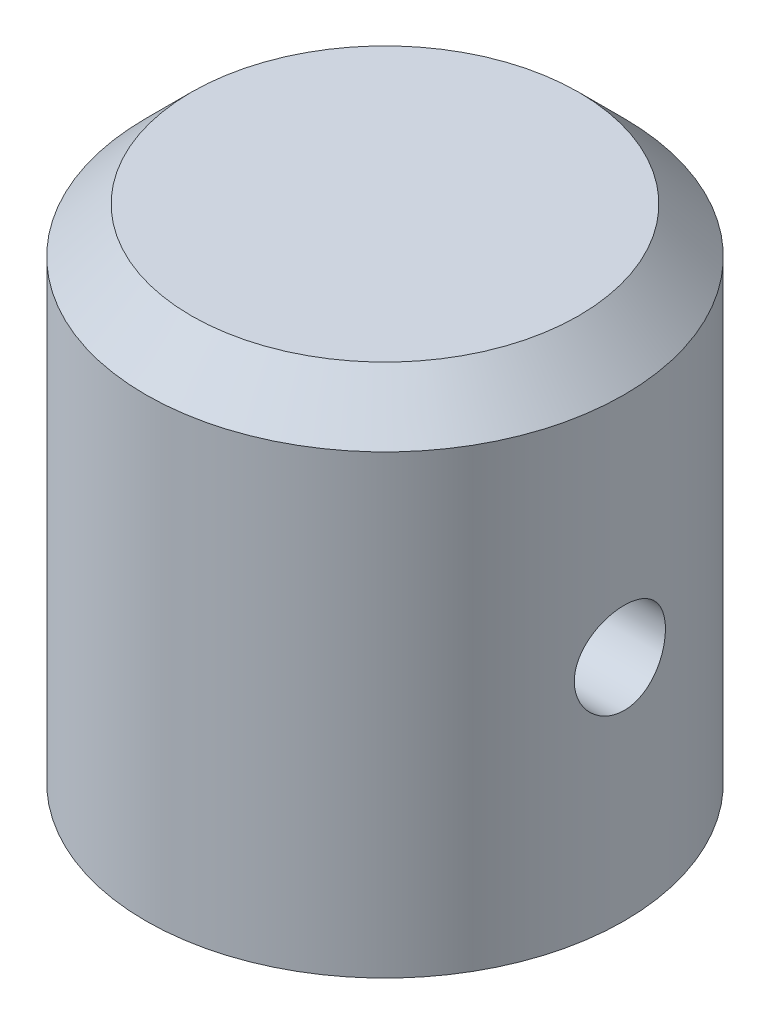
ISO-10303-21;
HEADER;
FILE_DESCRIPTION(('STEP AP214'),'2;1');
FILE_NAME('part.step','',(''),(''),'','','');
FILE_SCHEMA(('AUTOMOTIVE_DESIGN { 1 0 10303 214 1 1 1 1 }'));
ENDSEC;
DATA;
#1=APPLICATION_CONTEXT('core data for automotive mechanical design processes');
#2=APPLICATION_PROTOCOL_DEFINITION('international standard','automotive_design',2000,#1);
#3=PRODUCT_CONTEXT('',#1,'mechanical');
#4=PRODUCT('Part','Part','',(#3));
#5=PRODUCT_RELATED_PRODUCT_CATEGORY('part','',(#4));
#6=PRODUCT_DEFINITION_FORMATION('','',#4);
#7=PRODUCT_DEFINITION_CONTEXT('part definition',#1,'design');
#8=PRODUCT_DEFINITION('design','',#6,#7);
#9=PRODUCT_DEFINITION_SHAPE('','',#8);
#10=(LENGTH_UNIT() NAMED_UNIT(*) SI_UNIT(.MILLI.,.METRE.));
#11=(NAMED_UNIT(*) PLANE_ANGLE_UNIT() SI_UNIT($,.RADIAN.));
#12=(NAMED_UNIT(*) SI_UNIT($,.STERADIAN.) SOLID_ANGLE_UNIT());
#13=UNCERTAINTY_MEASURE_WITH_UNIT(LENGTH_MEASURE(1.E-05),#10,'distance_accuracy_value','');
#14=(GEOMETRIC_REPRESENTATION_CONTEXT(3) GLOBAL_UNCERTAINTY_ASSIGNED_CONTEXT((#13)) GLOBAL_UNIT_ASSIGNED_CONTEXT((#10,
#11,#12)) REPRESENTATION_CONTEXT('',''));
#15=CARTESIAN_POINT('',(0.,0.,0.));
#16=DIRECTION('',(0.,0.,1.));
#17=DIRECTION('',(1.,0.,0.));
#18=AXIS2_PLACEMENT_3D('',#15,#16,#17);
#19=CARTESIAN_POINT('',(-10.5,10.,0.));
#20=DIRECTION('',(1.,0.,0.));
#21=DIRECTION('',(0.,0.,-1.));
#22=AXIS2_PLACEMENT_3D('',#19,#20,#21);
#23=CYLINDRICAL_SURFACE('',#22,2.);
#24=CARTESIAN_POINT('',(5.,10.,0.));
#25=DIRECTION('',(-1.,0.,0.));
#26=DIRECTION('',(0.,0.,1.));
#27=AXIS2_PLACEMENT_3D('',#24,#25,#26);
#28=CIRCLE('',#27,2.);
#29=CARTESIAN_POINT('',(5.,10.,2.));
#30=VERTEX_POINT('',#29);
#31=EDGE_CURVE('E184',#30,#30,#28,.T.);
#32=ORIENTED_EDGE('',*,*,#31,.T.);
#33=EDGE_LOOP('',(#32));
#34=FACE_BOUND('',#33,.T.);
#35=CARTESIAN_POINT('',(10.3077640640442,10.,-2.));
#36=CARTESIAN_POINT('',(10.3077662331161,9.88875796571473,-1.99999576747856));
#37=CARTESIAN_POINT('',(10.3095844213753,9.77746139759584,-1.99068741084945));
#38=CARTESIAN_POINT('',(10.3166512903101,9.55800893114557,-1.95372640408913));
#39=CARTESIAN_POINT('',(10.3219028425853,9.44985574103166,-1.92605839800912));
#40=CARTESIAN_POINT('',(10.3352205759115,9.23989698271584,-1.85326060026377));
#41=CARTESIAN_POINT('',(10.3432840931504,9.13808551412126,-1.80814733034197));
#42=CARTESIAN_POINT('',(10.3613140447469,8.94348177979402,-1.70178371624362));
#43=CARTESIAN_POINT('',(10.3712803404791,8.85068885776445,-1.64053454751282));
#44=CARTESIAN_POINT('',(10.3921358315924,8.67555844408467,-1.50279954107446));
#45=CARTESIAN_POINT('',(10.4030343280567,8.59335356666773,-1.42614646664807));
#46=CARTESIAN_POINT('',(10.4244441525531,8.44288870773657,-1.2601409610314));
#47=CARTESIAN_POINT('',(10.4349554547355,8.37462965588197,-1.17078768389031));
#48=CARTESIAN_POINT('',(10.4545063484475,8.25348439750393,-0.981045466793122));
#49=CARTESIAN_POINT('',(10.4635337012442,8.20072345659818,-0.880575179073301));
#50=CARTESIAN_POINT('',(10.4789953609074,8.11287945215396,-0.671995748816202));
#51=CARTESIAN_POINT('',(10.4854298877952,8.07779488857456,-0.563887255355323));
#52=CARTESIAN_POINT('',(10.4949152003273,8.02671027905441,-0.344474928085005));
#53=CARTESIAN_POINT('',(10.4980056086445,8.01048658544844,-0.233224906241221));
#54=CARTESIAN_POINT('',(10.5005911121681,7.99688718076387,-0.00954197299762809));
#55=CARTESIAN_POINT('',(10.5000865229021,7.99950981557087,0.102890833726007));
#56=CARTESIAN_POINT('',(10.4955697879858,8.02335753885228,0.324213319087035));
#57=CARTESIAN_POINT('',(10.4916030541438,8.04434179306834,0.433130008737613));
#58=CARTESIAN_POINT('',(10.4806587329107,8.10393593464111,0.645867459868355));
#59=CARTESIAN_POINT('',(10.4736810332228,8.14254647938914,0.749688031123387));
#60=CARTESIAN_POINT('',(10.4574231445239,8.2365251783876,0.949982043237765));
#61=CARTESIAN_POINT('',(10.4481298452825,8.29198915833133,1.04640941469805));
#62=CARTESIAN_POINT('',(10.4282677453701,8.41802963236505,1.22867819746181));
#63=CARTESIAN_POINT('',(10.4176988110517,8.48860771054964,1.31451849765684));
#64=CARTESIAN_POINT('',(10.3962580003512,8.64419868339652,1.47460391847545));
#65=CARTESIAN_POINT('',(10.385383976594,8.72942229466572,1.54864409461801));
#66=CARTESIAN_POINT('',(10.3647181130096,8.91118441020868,1.68141214001886));
#67=CARTESIAN_POINT('',(10.3549262900386,9.00772309067514,1.74013977079181));
#68=CARTESIAN_POINT('',(10.3375301079842,9.2096519451659,1.84067693368896));
#69=CARTESIAN_POINT('',(10.3299297088641,9.31505770390328,1.88245589383698));
#70=CARTESIAN_POINT('',(10.3178369316443,9.53157019002549,1.94765282338577));
#71=CARTESIAN_POINT('',(10.3133441891954,9.64267624745234,1.97107294526376));
#72=CARTESIAN_POINT('',(10.3080477071057,9.86558516725025,1.9985865151718));
#73=CARTESIAN_POINT('',(10.3071877035286,9.97735034460876,2.0029747581422));
#74=CARTESIAN_POINT('',(10.3091034020993,10.2000162650894,1.99309094275412));
#75=CARTESIAN_POINT('',(10.3118789183607,10.3109170521167,1.97881983846034));
#76=CARTESIAN_POINT('',(10.3207004508845,10.5277319228755,1.9322757581448));
#77=CARTESIAN_POINT('',(10.3267182518009,10.6336805820355,1.9001580145427));
#78=CARTESIAN_POINT('',(10.3413218894342,10.8386927626591,1.81899736459844));
#79=CARTESIAN_POINT('',(10.349907920666,10.9377557619101,1.76995317622343));
#80=CARTESIAN_POINT('',(10.3688083137884,11.1274812587314,1.65565593283059));
#81=CARTESIAN_POINT('',(10.3791420142757,11.218029851452,1.5902170624993));
#82=CARTESIAN_POINT('',(10.4003193132972,11.3869678571224,1.44523791801398));
#83=CARTESIAN_POINT('',(10.4111629591442,11.4653561389262,1.36569633350552));
#84=CARTESIAN_POINT('',(10.432319564336,11.6088535163649,1.19345143615015));
#85=CARTESIAN_POINT('',(10.4426231174714,11.6737641022171,1.10058140595695));
#86=CARTESIAN_POINT('',(10.4613791209831,11.7870608833456,0.905083177029179));
#87=CARTESIAN_POINT('',(10.4698316441966,11.8354477288673,0.802455362488019));
#88=CARTESIAN_POINT('',(10.4838928326543,11.9140281547843,0.590897063083822));
#89=CARTESIAN_POINT('',(10.4895165603032,11.9443182600112,0.482003476197484));
#90=CARTESIAN_POINT('',(10.4973508525688,11.9861529335018,0.260557092128008));
#91=CARTESIAN_POINT('',(10.4995617883475,11.9976995402424,0.148004694222504));
#92=CARTESIAN_POINT('',(10.5003136791865,12.0016466204016,-0.0756624347074271));
#93=CARTESIAN_POINT('',(10.4989120431795,11.9943465907251,-0.186771797894079));
#94=CARTESIAN_POINT('',(10.4927159027535,11.9614648077175,-0.406149933837078));
#95=CARTESIAN_POINT('',(10.4879214331301,11.9358832418755,-0.514418735713432));
#96=CARTESIAN_POINT('',(10.4754786931883,11.8672923905992,-0.724877493923956));
#97=CARTESIAN_POINT('',(10.467835802495,11.8243159446475,-0.827078490952684));
#98=CARTESIAN_POINT('',(10.4505225438582,11.7221916193184,-1.02286315652585));
#99=CARTESIAN_POINT('',(10.4408520343067,11.6630426103686,-1.11644622254047));
#100=CARTESIAN_POINT('',(10.4203698549555,11.529226067606,-1.29382831156941));
#101=CARTESIAN_POINT('',(10.4095434656168,11.4543426430999,-1.37746278631429));
#102=CARTESIAN_POINT('',(10.3880613328083,11.2916299249206,-1.53108232354618));
#103=CARTESIAN_POINT('',(10.3774056301285,11.2037975864762,-1.60106416677551));
#104=CARTESIAN_POINT('',(10.3573593703099,11.0166708830197,-1.72602479696764));
#105=CARTESIAN_POINT('',(10.3479819394977,10.917274584498,-1.7808531172989));
#106=CARTESIAN_POINT('',(10.3317124385101,10.7105336472807,-1.87294496084189));
#107=CARTESIAN_POINT('',(10.3248180449097,10.6031965529242,-1.91022491447505));
#108=CARTESIAN_POINT('',(10.3157185929825,10.4129661415936,-1.95866569612499));
#109=CARTESIAN_POINT('',(10.312753537306,10.3311800996671,-1.97413922525694));
#110=CARTESIAN_POINT('',(10.3087754902806,10.16627283608,-1.99480781101633));
#111=CARTESIAN_POINT('',(10.3077624426974,10.0831516529524,-2.00000316374252));
#112=CARTESIAN_POINT('',(10.3077640640442,10.,-2.));
#113=B_SPLINE_CURVE_WITH_KNOTS('',3,(#35,#36,#37,#38,#39,#40,#41,#42,#43,#44,#45,#46,#47,#48,
#49,#50,#51,#52,#53,#54,#55,#56,#57,#58,#59,#60,#61,#62,#63,#64,#65,#66,#67,#68,#69,#70,#71,#72,
#73,#74,#75,#76,#77,#78,#79,#80,#81,#82,#83,#84,#85,#86,#87,#88,#89,#90,#91,#92,#93,#94,#95,#96,
#97,#98,#99,#100,#101,#102,#103,#104,#105,#106,#107,#108,#109,#110,#111,#112),.UNSPECIFIED.,.T.,
.F.,(4,2,2,2,2,2,2,2,2,2,2,2,2,2,2,2,2,2,2,2,2,2,2,2,2,2,2,2,2,2,2,2,2,2,2,2,2,2,4),(0.,
0.333421770793027,0.667122766528006,1.00050849774323,1.33386994964594,1.67106783624803,
2.0082881938789,2.34816357408133,2.68801010714635,3.0237843381305,3.35952909906649,
3.69093508873406,4.02235343955143,4.35569260286977,4.68906672027078,5.02771540514516,
5.36636936399093,5.70563149865265,6.0448538506621,6.37880260457192,6.71273428413006,
7.04380584853122,7.37490249426554,7.7099364375071,8.04500152677399,8.3846976464755,
8.72438039685044,9.06223477768128,9.40005241219932,9.73253485751046,10.0650138930459,
10.3968681534587,10.7287455981505,11.0655148874687,11.4023634904492,11.7424455878908,
12.0822086321944,12.3314432878497,12.580670763326),.UNSPECIFIED.);
#114=CARTESIAN_POINT('',(10.3077640640442,10.,-2.));
#115=VERTEX_POINT('',#114);
#116=EDGE_CURVE('E227',#115,#115,#113,.T.);
#117=ORIENTED_EDGE('',*,*,#116,.F.);
#118=EDGE_LOOP('',(#117));
#119=FACE_BOUND('',#118,.T.);
#120=CARTESIAN_POINT('',(7.,11.7860571099492,0.900000000000001));
#121=CARTESIAN_POINT('',(6.95240548689368,11.7860633816785,0.899993904872531));
#122=CARTESIAN_POINT('',(6.90475139816036,11.7879875333379,0.896200889187129));
#123=CARTESIAN_POINT('',(6.81084342785602,11.7954306988725,0.881188698473985));
#124=CARTESIAN_POINT('',(6.76459334315639,11.8009586846287,0.869950988465885));
#125=CARTESIAN_POINT('',(6.67503289355946,11.8148425724962,0.840599008940144));
#126=CARTESIAN_POINT('',(6.6317102221631,11.8231856207056,0.82251595111645));
#127=CARTESIAN_POINT('',(6.54872389073461,11.8417411519035,0.780079367805813));
#128=CARTESIAN_POINT('',(6.50905978540756,11.8519534069328,0.755726606794495));
#129=CARTESIAN_POINT('',(6.43160603570528,11.8739267677676,0.699546711070864));
#130=CARTESIAN_POINT('',(6.39411401006394,11.8857456447036,0.667331674041416));
#131=CARTESIAN_POINT('',(6.32484038468546,11.9091295629241,0.597153263851515));
#132=CARTESIAN_POINT('',(6.29306121084002,11.9206944945526,0.55918746124946));
#133=CARTESIAN_POINT('',(6.23450567582868,11.9429899222722,0.476161359501934));
#134=CARTESIAN_POINT('',(6.20807609709968,11.9536455831668,0.430834539343589));
#135=CARTESIAN_POINT('',(6.16334920878371,11.9721989802965,0.335810404296622));
#136=CARTESIAN_POINT('',(6.14504771729886,11.9800981343041,0.286115352664622));
#137=CARTESIAN_POINT('',(6.11821250843488,11.9918364673753,0.186901452751729));
#138=CARTESIAN_POINT('',(6.10916232212247,11.9958892821259,0.137548112421341));
#139=CARTESIAN_POINT('',(6.09940557553892,12.0002624891057,0.0378686070773556));
#140=CARTESIAN_POINT('',(6.09869502446314,12.0005846665733,-0.0124570810842969));
#141=CARTESIAN_POINT('',(6.10539384596546,11.9975769672949,-0.108849972245188));
#142=CARTESIAN_POINT('',(6.11223211788822,11.9945039384006,-0.15496649299864));
#143=CARTESIAN_POINT('',(6.13283927407891,11.9854174703071,-0.245315383693987));
#144=CARTESIAN_POINT('',(6.14660867198596,11.9794038131904,-0.289547613734815));
#145=CARTESIAN_POINT('',(6.18083122022899,11.9648904561395,-0.375691598160863));
#146=CARTESIAN_POINT('',(6.20138271461349,11.9563543826407,-0.417557901504178));
#147=CARTESIAN_POINT('',(6.24847851805163,11.9376063514301,-0.497357287702658));
#148=CARTESIAN_POINT('',(6.27502501830642,11.9273937813249,-0.535288925003648));
#149=CARTESIAN_POINT('',(6.33582233428805,11.9053259256319,-0.609380701173243));
#150=CARTESIAN_POINT('',(6.37052032933998,11.8934045818678,-0.645154693729103));
#151=CARTESIAN_POINT('',(6.4454029202132,11.8698437163006,-0.710559970434975));
#152=CARTESIAN_POINT('',(6.48559036328407,11.8582043444629,-0.740188046622067));
#153=CARTESIAN_POINT('',(6.57249427021132,11.8360075672965,-0.793695924071004));
#154=CARTESIAN_POINT('',(6.61941897480158,11.8255194409972,-0.817268860971868));
#155=CARTESIAN_POINT('',(6.71716561883767,11.8076774967904,-0.856015337124758));
#156=CARTESIAN_POINT('',(6.76798420018762,11.8003210132533,-0.871196023095028));
#157=CARTESIAN_POINT('',(6.86819749552869,11.7902708240695,-0.891656994529559));
#158=CARTESIAN_POINT('',(6.91743255225251,11.7872803113152,-0.897569748987038));
#159=CARTESIAN_POINT('',(7.01627172402793,11.7854490541598,-0.901208969880136));
#160=CARTESIAN_POINT('',(7.06587566107441,11.7866064233285,-0.898939157691919));
#161=CARTESIAN_POINT('',(7.15984006595055,11.792630036074,-0.886856864654279));
#162=CARTESIAN_POINT('',(7.20430232391156,11.7971918417215,-0.877662975422488));
#163=CARTESIAN_POINT('',(7.29099986183819,11.8090976996132,-0.852850169677464));
#164=CARTESIAN_POINT('',(7.33323455613474,11.8164424794412,-0.83722957286682));
#165=CARTESIAN_POINT('',(7.41641926831179,11.8334859252706,-0.799237138333728));
#166=CARTESIAN_POINT('',(7.4572253459788,11.8432758438885,-0.776592491950458));
#167=CARTESIAN_POINT('',(7.53467344552787,11.8639958227239,-0.72545171155635));
#168=CARTESIAN_POINT('',(7.57131346835808,11.8749264255066,-0.696952786665907));
#169=CARTESIAN_POINT('',(7.64313021517626,11.8979853378193,-0.631635509686241));
#170=CARTESIAN_POINT('',(7.67781275807023,11.9101261666115,-0.594275910014919));
#171=CARTESIAN_POINT('',(7.74053061755696,11.9332704992432,-0.514011989746338));
#172=CARTESIAN_POINT('',(7.76856488888821,11.9442738240878,-0.471106798890537));
#173=CARTESIAN_POINT('',(7.81735845662652,11.9640701715873,-0.380272883636556));
#174=CARTESIAN_POINT('',(7.83804251305553,11.9728400880281,-0.332298381010364));
#175=CARTESIAN_POINT('',(7.87087049944586,11.9870063343014,-0.233047815748499));
#176=CARTESIAN_POINT('',(7.88302045042899,11.9924050423056,-0.181774108719048));
#177=CARTESIAN_POINT('',(7.89758841699084,11.9989064539792,-0.0817579255423364));
#178=CARTESIAN_POINT('',(7.90069993527727,12.0003150723876,-0.0331358435645516));
#179=CARTESIAN_POINT('',(7.89903647515287,11.9995663192658,0.063939311982212));
#180=CARTESIAN_POINT('',(7.89426332482474,11.9974097743287,0.112392422117786));
#181=CARTESIAN_POINT('',(7.87745905729307,11.9899452279521,0.205419795030557));
#182=CARTESIAN_POINT('',(7.86577421827136,11.984787762853,0.250069779822175));
#183=CARTESIAN_POINT('',(7.8358886480381,11.9719351881313,0.336738101718439));
#184=CARTESIAN_POINT('',(7.81768679439651,11.964239641391,0.37875598402859));
#185=CARTESIAN_POINT('',(7.77437010946806,11.9465971533873,0.461100677624791));
#186=CARTESIAN_POINT('',(7.74897684147462,11.9365632397784,0.501261896017323));
#187=CARTESIAN_POINT('',(7.69237758151538,11.915384653613,0.576929844379538));
#188=CARTESIAN_POINT('',(7.66116908351477,11.9042395031428,0.612434556376683));
#189=CARTESIAN_POINT('',(7.59086647347915,11.8809403414396,0.680786789817283));
#190=CARTESIAN_POINT('',(7.5513385975932,11.8687776762661,0.713186761450655));
#191=CARTESIAN_POINT('',(7.46709014871487,11.8456801752123,0.770997488724106));
#192=CARTESIAN_POINT('',(7.42236626362991,11.8347461313231,0.796403751217171));
#193=CARTESIAN_POINT('',(7.32847541836615,11.8154269028403,0.839517050419588));
#194=CARTESIAN_POINT('',(7.27928321166691,11.8070575410668,0.857176570884019));
#195=CARTESIAN_POINT('',(7.17820111079373,11.7942327469945,0.883716361106234));
#196=CARTESIAN_POINT('',(7.12632089442746,11.7897641842428,0.892626096216153));
#197=CARTESIAN_POINT('',(7.04942674160882,11.7865680275393,0.898984642632157));
#198=CARTESIAN_POINT('',(7.02472140738367,11.7860538523052,0.900003165913872));
#199=CARTESIAN_POINT('',(7.,11.7860571099492,0.900000000000001));
#200=B_SPLINE_CURVE_WITH_KNOTS('',3,(#120,#121,#122,#123,#124,#125,#126,#127,#128,#129,#130,
#131,#132,#133,#134,#135,#136,#137,#138,#139,#140,#141,#142,#143,#144,#145,#146,#147,#148,#149,
#150,#151,#152,#153,#154,#155,#156,#157,#158,#159,#160,#161,#162,#163,#164,#165,#166,#167,#168,
#169,#170,#171,#172,#173,#174,#175,#176,#177,#178,#179,#180,#181,#182,#183,#184,#185,#186,#187,
#188,#189,#190,#191,#192,#193,#194,#195,#196,#197,#198,#199),.UNSPECIFIED.,.T.,.F.,(4,2,2,2,2,2,
2,2,2,2,2,2,2,2,2,2,2,2,2,2,2,2,2,2,2,2,2,2,2,2,2,2,2,2,2,2,2,2,2,4),(0.,0.142703897195021,
0.285764424829257,0.428180367939293,0.5705789542474,0.722398407778391,0.874282178053421,
1.03407679431295,1.19378910078847,1.34399687882985,1.49413277430874,1.63364332074006,
1.77316420728406,1.91480430355704,2.05649625394221,2.20955360005846,2.36269063707454,
2.52250293779006,2.68217893421482,2.83039266934072,2.97853900636436,3.11482143159979,
3.25113951127788,3.39360809190202,3.53614474910745,3.69263163774131,3.84914311343323,
4.00721344708392,4.1651721458928,4.31064184199307,4.45607781526713,4.59478006216421,
4.73350620934803,4.87858610046381,5.02372865800169,5.18061690173492,5.33760570518744,
5.49554440847013,5.65294940233066,5.7270722569949),.UNSPECIFIED.);
#201=CARTESIAN_POINT('',(7.,11.7860571099492,0.900000000000001));
#202=VERTEX_POINT('',#201);
#203=EDGE_CURVE('E186',#202,#202,#200,.T.);
#204=ORIENTED_EDGE('',*,*,#203,.F.);
#205=EDGE_LOOP('',(#204));
#206=FACE_BOUND('',#205,.T.);
#207=CARTESIAN_POINT('',(7.,8.21394289005082,0.900000000000001));
#208=CARTESIAN_POINT('',(7.04759451310632,8.21393661832147,0.899993904872531));
#209=CARTESIAN_POINT('',(7.09524860183965,8.21201246666209,0.896200889187129));
#210=CARTESIAN_POINT('',(7.18915657214398,8.20456930112749,0.881188698473985));
#211=CARTESIAN_POINT('',(7.23540665684361,8.19904131537126,0.869950988465885));
#212=CARTESIAN_POINT('',(7.32496710644055,8.18515742750378,0.840599008940144));
#213=CARTESIAN_POINT('',(7.3682897778369,8.17681437929445,0.822515951116449));
#214=CARTESIAN_POINT('',(7.45127610926539,8.15825884809646,0.780079367805812));
#215=CARTESIAN_POINT('',(7.49094021459244,8.14804659306724,0.755726606794494));
#216=CARTESIAN_POINT('',(7.56839396429472,8.12607323223243,0.699546711070863));
#217=CARTESIAN_POINT('',(7.60588598993606,8.11425435529641,0.667331674041415));
#218=CARTESIAN_POINT('',(7.67515961531454,8.09087043707592,0.597153263851514));
#219=CARTESIAN_POINT('',(7.70693878915998,8.07930550544744,0.559187461249459));
#220=CARTESIAN_POINT('',(7.76549432417132,8.05701007772778,0.476161359501933));
#221=CARTESIAN_POINT('',(7.79192390290032,8.04635441683316,0.430834539343587));
#222=CARTESIAN_POINT('',(7.83665079121629,8.02780101970347,0.335810404296619));
#223=CARTESIAN_POINT('',(7.85495228270114,8.01990186569593,0.28611535266462));
#224=CARTESIAN_POINT('',(7.88178749156512,8.00816353262465,0.186901452751727));
#225=CARTESIAN_POINT('',(7.89083767787753,8.00411071787413,0.13754811242134));
#226=CARTESIAN_POINT('',(7.90059442446108,7.9997375108943,0.0378686070773538));
#227=CARTESIAN_POINT('',(7.90130497553686,7.99941533342668,-0.0124570810842988));
#228=CARTESIAN_POINT('',(7.89460615403454,8.00242303270508,-0.10884997224519));
#229=CARTESIAN_POINT('',(7.88776788211178,8.00549606159944,-0.154966492998641));
#230=CARTESIAN_POINT('',(7.86716072592109,8.01458252969286,-0.245315383693988));
#231=CARTESIAN_POINT('',(7.85339132801404,8.02059618680962,-0.289547613734816));
#232=CARTESIAN_POINT('',(7.81916877977101,8.03510954386048,-0.375691598160863));
#233=CARTESIAN_POINT('',(7.79861728538651,8.04364561735929,-0.417557901504178));
#234=CARTESIAN_POINT('',(7.75152148194837,8.06239364856994,-0.497357287702658));
#235=CARTESIAN_POINT('',(7.72497498169358,8.07260621867506,-0.535288925003648));
#236=CARTESIAN_POINT('',(7.66417766571195,8.09467407436806,-0.609380701173243));
#237=CARTESIAN_POINT('',(7.62947967066002,8.10659541813224,-0.645154693729103));
#238=CARTESIAN_POINT('',(7.5545970797868,8.13015628369938,-0.710559970434975));
#239=CARTESIAN_POINT('',(7.51440963671593,8.14179565553708,-0.740188046622067));
#240=CARTESIAN_POINT('',(7.42750572978868,8.16399243270349,-0.793695924071004));
#241=CARTESIAN_POINT('',(7.38058102519842,8.1744805590028,-0.817268860971867));
#242=CARTESIAN_POINT('',(7.28283438116233,8.19232250320962,-0.856015337124758));
#243=CARTESIAN_POINT('',(7.23201579981238,8.19967898674667,-0.871196023095028));
#244=CARTESIAN_POINT('',(7.13180250447131,8.20972917593048,-0.891656994529559));
#245=CARTESIAN_POINT('',(7.08256744774749,8.21271968868478,-0.897569748987038));
#246=CARTESIAN_POINT('',(6.98372827597207,8.21455094584023,-0.901208969880136));
#247=CARTESIAN_POINT('',(6.93412433892559,8.21339357667153,-0.898939157691919));
#248=CARTESIAN_POINT('',(6.84015993404945,8.20736996392601,-0.886856864654279));
#249=CARTESIAN_POINT('',(6.79569767608844,8.20280815827846,-0.877662975422488));
#250=CARTESIAN_POINT('',(6.70900013816181,8.19090230038679,-0.852850169677463));
#251=CARTESIAN_POINT('',(6.66676544386526,8.18355752055876,-0.837229572866819));
#252=CARTESIAN_POINT('',(6.58358073168821,8.16651407472943,-0.799237138333728));
#253=CARTESIAN_POINT('',(6.5427746540212,8.15672415611151,-0.776592491950457));
#254=CARTESIAN_POINT('',(6.46532655447212,8.13600417727607,-0.725451711556348));
#255=CARTESIAN_POINT('',(6.42868653164192,8.12507357449344,-0.696952786665905));
#256=CARTESIAN_POINT('',(6.35686978482374,8.10201466218066,-0.631635509686238));
#257=CARTESIAN_POINT('',(6.32218724192977,8.08987383338854,-0.594275910014914));
#258=CARTESIAN_POINT('',(6.25946938244304,8.0667295007568,-0.514011989746333));
#259=CARTESIAN_POINT('',(6.23143511111179,8.05572617591221,-0.471106798890532));
#260=CARTESIAN_POINT('',(6.18264154337348,8.03592982841274,-0.380272883636552));
#261=CARTESIAN_POINT('',(6.16195748694447,8.02715991197193,-0.33229838101036));
#262=CARTESIAN_POINT('',(6.12912950055414,8.01299366569858,-0.233047815748495));
#263=CARTESIAN_POINT('',(6.11697954957101,8.00759495769441,-0.181774108719044));
#264=CARTESIAN_POINT('',(6.10241158300916,8.00109354602083,-0.0817579255423331));
#265=CARTESIAN_POINT('',(6.09930006472273,7.9996849276124,-0.0331358435645485));
#266=CARTESIAN_POINT('',(6.10096352484713,8.0004336807342,0.0639393119822145));
#267=CARTESIAN_POINT('',(6.10573667517526,8.00259022567134,0.112392422117788));
#268=CARTESIAN_POINT('',(6.12254094270693,8.0100547720479,0.205419795030558));
#269=CARTESIAN_POINT('',(6.13422578172864,8.01521223714699,0.250069779822176));
#270=CARTESIAN_POINT('',(6.1641113519619,8.02806481186874,0.33673810171844));
#271=CARTESIAN_POINT('',(6.18231320560349,8.035760358609,0.378755984028591));
#272=CARTESIAN_POINT('',(6.22562989053194,8.05340284661265,0.461100677624791));
#273=CARTESIAN_POINT('',(6.25102315852538,8.06343676022161,0.501261896017323));
#274=CARTESIAN_POINT('',(6.30762241848462,8.08461534638698,0.576929844379538));
#275=CARTESIAN_POINT('',(6.33883091648523,8.09576049685723,0.612434556376684));
#276=CARTESIAN_POINT('',(6.40913352652085,8.11905965856045,0.680786789817283));
#277=CARTESIAN_POINT('',(6.4486614024068,8.13122232373387,0.713186761450655));
#278=CARTESIAN_POINT('',(6.53290985128513,8.15431982478771,0.770997488724105));
#279=CARTESIAN_POINT('',(6.57763373637009,8.1652538686769,0.796403751217171));
#280=CARTESIAN_POINT('',(6.67152458163385,8.18457309715967,0.839517050419588));
#281=CARTESIAN_POINT('',(6.72071678833309,8.19294245893325,0.857176570884019));
#282=CARTESIAN_POINT('',(6.82179888920627,8.20576725300551,0.883716361106234));
#283=CARTESIAN_POINT('',(6.87367910557254,8.2102358157572,0.892626096216153));
#284=CARTESIAN_POINT('',(6.95057325839119,8.2134319724607,0.898984642632157));
#285=CARTESIAN_POINT('',(6.97527859261633,8.21394614769475,0.900003165913872));
#286=CARTESIAN_POINT('',(7.,8.21394289005082,0.900000000000001));
#287=B_SPLINE_CURVE_WITH_KNOTS('',3,(#207,#208,#209,#210,#211,#212,#213,#214,#215,#216,#217,
#218,#219,#220,#221,#222,#223,#224,#225,#226,#227,#228,#229,#230,#231,#232,#233,#234,#235,#236,
#237,#238,#239,#240,#241,#242,#243,#244,#245,#246,#247,#248,#249,#250,#251,#252,#253,#254,#255,
#256,#257,#258,#259,#260,#261,#262,#263,#264,#265,#266,#267,#268,#269,#270,#271,#272,#273,#274,
#275,#276,#277,#278,#279,#280,#281,#282,#283,#284,#285,#286),.UNSPECIFIED.,.T.,.F.,(4,2,2,2,2,2,
2,2,2,2,2,2,2,2,2,2,2,2,2,2,2,2,2,2,2,2,2,2,2,2,2,2,2,2,2,2,2,2,2,4),(0.,0.142703897195023,
0.285764424829258,0.428180367939294,0.570578954247402,0.722398407778393,0.874282178053422,
1.03407679431295,1.19378910078847,1.34399687882985,1.49413277430874,1.63364332074006,
1.77316420728406,1.91480430355704,2.05649625394221,2.20955360005846,2.36269063707454,
2.52250293779006,2.68217893421482,2.83039266934072,2.97853900636436,3.11482143159979,
3.25113951127789,3.39360809190202,3.53614474910745,3.69263163774132,3.84914311343323,
4.00721344708392,4.1651721458928,4.31064184199307,4.45607781526714,4.59478006216421,
4.73350620934803,4.87858610046381,5.02372865800169,5.18061690173492,5.33760570518744,
5.49554440847013,5.65294940233066,5.7270722569949),.UNSPECIFIED.);
#288=CARTESIAN_POINT('',(7.,8.21394289005082,0.900000000000001));
#289=VERTEX_POINT('',#288);
#290=EDGE_CURVE('E46',#289,#289,#287,.T.);
#291=ORIENTED_EDGE('',*,*,#290,.F.);
#292=EDGE_LOOP('',(#291));
#293=FACE_BOUND('',#292,.T.);
#294=ADVANCED_FACE('F41',(#34,#119,#206,#293),#23,.F.);
#295=CARTESIAN_POINT('',(0.,0.,0.));
#296=DIRECTION('',(0.,1.,0.));
#297=DIRECTION('',(0.,0.,1.));
#298=AXIS2_PLACEMENT_3D('',#295,#296,#297);
#299=PLANE('',#298);
#300=CARTESIAN_POINT('',(7.,0.,0.));
#301=DIRECTION('',(0.,1.,0.));
#302=DIRECTION('',(0.,0.,1.));
#303=AXIS2_PLACEMENT_3D('',#300,#301,#302);
#304=CIRCLE('',#303,0.900000000000001);
#305=CARTESIAN_POINT('',(7.,0.,0.900000000000001));
#306=VERTEX_POINT('',#305);
#307=EDGE_CURVE('E185',#306,#306,#304,.F.);
#308=ORIENTED_EDGE('',*,*,#307,.F.);
#309=EDGE_LOOP('',(#308));
#310=FACE_BOUND('',#309,.T.);
#311=CARTESIAN_POINT('',(0.,0.,0.));
#312=DIRECTION('',(0.,1.,0.));
#313=DIRECTION('',(0.,0.,1.));
#314=AXIS2_PLACEMENT_3D('',#311,#312,#313);
#315=CIRCLE('',#314,10.5);
#316=CARTESIAN_POINT('',(0.,0.,10.5));
#317=VERTEX_POINT('',#316);
#318=EDGE_CURVE('E177',#317,#317,#315,.T.);
#319=ORIENTED_EDGE('',*,*,#318,.F.);
#320=EDGE_LOOP('',(#319));
#321=FACE_BOUND('',#320,.T.);
#322=CARTESIAN_POINT('',(-2.86093426815063,0.,5.36093426815063));
#323=DIRECTION('',(0.,1.,0.));
#324=DIRECTION('',(0.,0.,1.));
#325=AXIS2_PLACEMENT_3D('',#322,#323,#324);
#326=CIRCLE('',#325,2.13906573184937);
#327=CARTESIAN_POINT('',(-5.,0.,5.36093426815061));
#328=VERTEX_POINT('',#327);
#329=CARTESIAN_POINT('',(-2.86093426815061,0.,7.5));
#330=VERTEX_POINT('',#329);
#331=EDGE_CURVE('E64',#328,#330,#326,.T.);
#332=ORIENTED_EDGE('',*,*,#331,.T.);
#333=DIRECTION('',(1.,0.,0.));
#334=VECTOR('',#333,1.);
#335=CARTESIAN_POINT('',(-2.86093426815061,0.,7.5));
#336=LINE('',#335,#334);
#337=CARTESIAN_POINT('',(2.86093426815061,0.,7.5));
#338=VERTEX_POINT('',#337);
#339=EDGE_CURVE('E147',#330,#338,#336,.T.);
#340=ORIENTED_EDGE('',*,*,#339,.T.);
#341=CARTESIAN_POINT('',(2.86093426815063,0.,5.36093426815063));
#342=DIRECTION('',(0.,-1.,0.));
#343=DIRECTION('',(0.,0.,-1.));
#344=AXIS2_PLACEMENT_3D('',#341,#342,#343);
#345=CIRCLE('',#344,2.13906573184937);
#346=CARTESIAN_POINT('',(5.,0.,5.36093426815061));
#347=VERTEX_POINT('',#346);
#348=EDGE_CURVE('E151',#347,#338,#345,.T.);
#349=ORIENTED_EDGE('',*,*,#348,.F.);
#350=DIRECTION('',(0.,0.,-1.));
#351=VECTOR('',#350,1.);
#352=CARTESIAN_POINT('',(5.,0.,5.36093426815061));
#353=LINE('',#352,#351);
#354=CARTESIAN_POINT('',(5.,0.,-5.36093426815061));
#355=VERTEX_POINT('',#354);
#356=EDGE_CURVE('E154',#347,#355,#353,.T.);
#357=ORIENTED_EDGE('',*,*,#356,.T.);
#358=CARTESIAN_POINT('',(2.86093426815063,0.,-5.36093426815063));
#359=DIRECTION('',(0.,-1.,0.));
#360=DIRECTION('',(0.,0.,-1.));
#361=AXIS2_PLACEMENT_3D('',#358,#359,#360);
#362=CIRCLE('',#361,2.13906573184937);
#363=CARTESIAN_POINT('',(2.86093426815062,0.,-7.5));
#364=VERTEX_POINT('',#363);
#365=EDGE_CURVE('E157',#364,#355,#362,.T.);
#366=ORIENTED_EDGE('',*,*,#365,.F.);
#367=DIRECTION('',(1.,0.,0.));
#368=VECTOR('',#367,1.);
#369=CARTESIAN_POINT('',(-2.86093426815061,0.,-7.5));
#370=LINE('',#369,#368);
#371=CARTESIAN_POINT('',(-2.86093426815061,0.,-7.5));
#372=VERTEX_POINT('',#371);
#373=EDGE_CURVE('E160',#372,#364,#370,.T.);
#374=ORIENTED_EDGE('',*,*,#373,.F.);
#375=CARTESIAN_POINT('',(-2.86093426815063,0.,-5.36093426815063));
#376=DIRECTION('',(0.,-1.,0.));
#377=DIRECTION('',(0.,0.,-1.));
#378=AXIS2_PLACEMENT_3D('',#375,#376,#377);
#379=CIRCLE('',#378,2.13906573184937);
#380=CARTESIAN_POINT('',(-5.,0.,-5.36093426815061));
#381=VERTEX_POINT('',#380);
#382=EDGE_CURVE('E126',#381,#372,#379,.T.);
#383=ORIENTED_EDGE('',*,*,#382,.F.);
#384=DIRECTION('',(0.,0.,-1.));
#385=VECTOR('',#384,1.);
#386=CARTESIAN_POINT('',(-5.,0.,5.36093426815061));
#387=LINE('',#386,#385);
#388=EDGE_CURVE('E163',#328,#381,#387,.T.);
#389=ORIENTED_EDGE('',*,*,#388,.F.);
#390=EDGE_LOOP('',(#332,#340,#349,#357,#366,#374,#383,#389));
#391=FACE_BOUND('',#390,.T.);
#392=ADVANCED_FACE('F214',(#310,#321,#391),#299,.F.);
#393=CARTESIAN_POINT('',(0.,22.,0.));
#394=DIRECTION('',(0.,-1.,0.));
#395=DIRECTION('',(0.,0.,-1.));
#396=AXIS2_PLACEMENT_3D('',#393,#394,#395);
#397=CYLINDRICAL_SURFACE('',#396,10.5);
#398=CARTESIAN_POINT('',(-10.5,8.,0.));
#399=CARTESIAN_POINT('',(-10.4999979743929,8.00000421621363,-0.111262673206796));
#400=CARTESIAN_POINT('',(-10.4982132825978,8.00931591028933,-0.222579835098419));
#401=CARTESIAN_POINT('',(-10.4912658417577,8.04629137476166,-0.44207506584808));
#402=CARTESIAN_POINT('',(-10.4861002806795,8.07397042244414,-0.550250443240319));
#403=CARTESIAN_POINT('',(-10.472968696399,8.14680050282468,-0.760256182328711));
#404=CARTESIAN_POINT('',(-10.4650052387144,8.19193553315135,-0.862092256456915));
#405=CARTESIAN_POINT('',(-10.4471465532496,8.29835043699249,-1.05673744629992));
#406=CARTESIAN_POINT('',(-10.4372514721844,8.35962908445376,-1.14954724679715));
#407=CARTESIAN_POINT('',(-10.4164844504796,8.49739426578834,-1.3246595476384));
#408=CARTESIAN_POINT('',(-10.4056029207544,8.57404141937447,-1.40683456028832));
#409=CARTESIAN_POINT('',(-10.3841602588096,8.74002242109596,-1.55724150943449));
#410=CARTESIAN_POINT('',(-10.3735991501089,8.82935719778339,-1.62547242453059));
#411=CARTESIAN_POINT('',(-10.3538997919733,9.01908226920558,-1.74658749191595));
#412=CARTESIAN_POINT('',(-10.3447739002785,9.11955709310997,-1.79934141753669));
#413=CARTESIAN_POINT('',(-10.3291136064192,9.32814634260273,-1.8871712132609));
#414=CARTESIAN_POINT('',(-10.3225789732761,9.43626008626301,-1.92224865908));
#415=CARTESIAN_POINT('',(-10.3129377029114,9.65569234277907,-1.97331952032964));
#416=CARTESIAN_POINT('',(-10.3097911053349,9.76695724535171,-1.98953558464559));
#417=CARTESIAN_POINT('',(-10.307161743861,9.99066960046048,-2.00311456964474));
#418=CARTESIAN_POINT('',(-10.307678640748,10.1031169425477,-2.00047923584385));
#419=CARTESIAN_POINT('',(-10.3122815009876,10.3243854627453,-1.97661064931592));
#420=CARTESIAN_POINT('',(-10.3163187841917,10.4332351655737,-1.95563105143299));
#421=CARTESIAN_POINT('',(-10.3274310100144,10.6458410804289,-1.89606915178378));
#422=CARTESIAN_POINT('',(-10.3345060854497,10.74959706953,-1.85748608036295));
#423=CARTESIAN_POINT('',(-10.3509473410172,10.9498098840211,-1.76356576724441));
#424=CARTESIAN_POINT('',(-10.3603273986465,11.0462176819518,-1.70812654193732));
#425=CARTESIAN_POINT('',(-10.3803126085096,11.2284576581049,-1.58213972356485));
#426=CARTESIAN_POINT('',(-10.3909178888643,11.314288728381,-1.51159054979958));
#427=CARTESIAN_POINT('',(-10.4123704255534,11.4744039305281,-1.35602107880719));
#428=CARTESIAN_POINT('',(-10.4232188107929,11.5484773772791,-1.27078393030956));
#429=CARTESIAN_POINT('',(-10.4437767134731,11.6813062387182,-1.08898253988166));
#430=CARTESIAN_POINT('',(-10.4534862187906,11.7400614903535,-0.992418177396046));
#431=CARTESIAN_POINT('',(-10.4706929218926,11.8406189958384,-0.790480381930608));
#432=CARTESIAN_POINT('',(-10.4781871907582,11.8823988323844,-0.685095520747789));
#433=CARTESIAN_POINT('',(-10.4900964856593,11.9476038217401,-0.468628740120913));
#434=CARTESIAN_POINT('',(-10.4945118494381,11.9710309877975,-0.357547446987754));
#435=CARTESIAN_POINT('',(-10.4997193000827,11.9985712036361,-0.134653102166432));
#436=CARTESIAN_POINT('',(-10.5005655209332,12.0029728435002,-0.0228769320529701));
#437=CARTESIAN_POINT('',(-10.498689066668,11.9931118947015,0.199814110807045));
#438=CARTESIAN_POINT('',(-10.4959665727471,11.9788502536322,0.310729026994549));
#439=CARTESIAN_POINT('',(-10.487292340486,11.9323074736684,0.527630088071934));
#440=CARTESIAN_POINT('',(-10.481366867614,11.9001728379361,0.633648811820642));
#441=CARTESIAN_POINT('',(-10.4669484110117,11.8189551525294,0.838793713663825));
#442=CARTESIAN_POINT('',(-10.4584552486531,11.7698709236771,0.937919411636065));
#443=CARTESIAN_POINT('',(-10.4397084980025,11.6555119948254,1.12769270122682));
#444=CARTESIAN_POINT('',(-10.4294362000209,11.5900615582954,1.21823250626953));
#445=CARTESIAN_POINT('',(-10.4083178834007,11.4450653311663,1.3871474593601));
#446=CARTESIAN_POINT('',(-10.3974718094254,11.3655181792897,1.46552143121745));
#447=CARTESIAN_POINT('',(-10.376248096682,11.1932783505025,1.60898057767487));
#448=CARTESIAN_POINT('',(-10.3658789338459,11.100420185608,1.67386852879691));
#449=CARTESIAN_POINT('',(-10.3469557185905,10.9049524302999,1.78712564506345));
#450=CARTESIAN_POINT('',(-10.3384015974216,10.8023432094476,1.83549543592105));
#451=CARTESIAN_POINT('',(-10.3241439661812,10.5907790279234,1.9140659733558));
#452=CARTESIAN_POINT('',(-10.3184264827985,10.4818581855824,1.94435593447319));
#453=CARTESIAN_POINT('',(-10.3104580861843,10.2603537285239,1.98618111220628));
#454=CARTESIAN_POINT('',(-10.3082067678363,10.1477705434226,1.99771852058121));
#455=CARTESIAN_POINT('',(-10.3074466067947,9.92411381076729,2.00163592783615));
#456=CARTESIAN_POINT('',(-10.3088769648064,9.81304580232384,1.99432714952507));
#457=CARTESIAN_POINT('',(-10.3151839360293,9.59375270386313,1.96144230631373));
#458=CARTESIAN_POINT('',(-10.3200605270675,9.48552759555925,1.93586635894473));
#459=CARTESIAN_POINT('',(-10.3326845207864,9.27516695144504,1.86730626858449));
#460=CARTESIAN_POINT('',(-10.3404261915088,9.17301972649355,1.82435686755864));
#461=CARTESIAN_POINT('',(-10.357911918352,8.97733152380696,1.72230346338687));
#462=CARTESIAN_POINT('',(-10.367656122152,8.88379118153405,1.66319826870575));
#463=CARTESIAN_POINT('',(-10.3882370930006,8.70641518234009,1.52943348647548));
#464=CARTESIAN_POINT('',(-10.3990884079132,8.62275169132001,1.45454780090303));
#465=CARTESIAN_POINT('',(-10.4205531347344,8.46907465998554,1.29181816695002));
#466=CARTESIAN_POINT('',(-10.4311664914262,8.39906425936234,1.20397124611785));
#467=CARTESIAN_POINT('',(-10.4510758496987,8.27406848713434,1.01682937761761));
#468=CARTESIAN_POINT('',(-10.4603586261554,8.21922950459286,0.917435200046733));
#469=CARTESIAN_POINT('',(-10.4764315464421,8.12711716159649,0.710697887659055));
#470=CARTESIAN_POINT('',(-10.4832240083557,8.0898274563583,0.603362257508453));
#471=CARTESIAN_POINT('',(-10.49218127144,8.04136262715925,0.41310668558492));
#472=CARTESIAN_POINT('',(-10.4950965973909,8.025878415039,0.331292443577403));
#473=CARTESIAN_POINT('',(-10.4990066930654,8.00519566348294,0.166328928394718));
#474=CARTESIAN_POINT('',(-10.5000015143387,7.99999684796943,0.0831796911135109));
#475=CARTESIAN_POINT('',(-10.5,8.,0.));
#476=B_SPLINE_CURVE_WITH_KNOTS('',3,(#398,#399,#400,#401,#402,#403,#404,#405,#406,#407,#408,
#409,#410,#411,#412,#413,#414,#415,#416,#417,#418,#419,#420,#421,#422,#423,#424,#425,#426,#427,
#428,#429,#430,#431,#432,#433,#434,#435,#436,#437,#438,#439,#440,#441,#442,#443,#444,#445,#446,
#447,#448,#449,#450,#451,#452,#453,#454,#455,#456,#457,#458,#459,#460,#461,#462,#463,#464,#465,
#466,#467,#468,#469,#470,#471,#472,#473,#474,#475),.UNSPECIFIED.,.T.,.F.,(4,2,2,2,2,2,2,2,2,2,2,
2,2,2,2,2,2,2,2,2,2,2,2,2,2,2,2,2,2,2,2,2,2,2,2,2,2,2,4),(0.,0.333483802430039,
0.667245332623755,1.00070161708277,1.33413258396015,1.67124928303734,2.0083906669481,
2.34829242006153,2.6881638683125,3.0239812313765,3.35976750035631,3.69098283657375,
4.02221265549117,4.35548777386576,4.68879777425772,5.02753295594229,5.36627174310674,
5.70545641749535,6.04460387885447,6.37858849301337,6.71255615038158,7.04382581519731,
7.37511853098563,7.71013402869825,8.04518189550174,8.38482983470166,8.72446490650363,
9.06240989581903,9.40031538398819,9.73267662393089,10.0650357254753,10.3967334632936,
10.728455671356,11.065300358868,11.4022224167316,11.7422902517103,12.082040729505,
12.3313590630718,12.5806707044157),.UNSPECIFIED.);
#477=CARTESIAN_POINT('',(-10.5,8.,0.));
#478=VERTEX_POINT('',#477);
#479=EDGE_CURVE('E148',#478,#478,#476,.T.);
#480=ORIENTED_EDGE('',*,*,#479,.T.);
#481=EDGE_LOOP('',(#480));
#482=FACE_BOUND('',#481,.T.);
#483=ORIENTED_EDGE('',*,*,#116,.T.);
#484=EDGE_LOOP('',(#483));
#485=FACE_BOUND('',#484,.T.);
#486=CARTESIAN_POINT('',(0.,20.,0.));
#487=DIRECTION('',(0.,1.,0.));
#488=DIRECTION('',(0.,0.,1.));
#489=AXIS2_PLACEMENT_3D('',#486,#487,#488);
#490=CIRCLE('',#489,10.5);
#491=CARTESIAN_POINT('',(0.,20.,10.5));
#492=VERTEX_POINT('',#491);
#493=EDGE_CURVE('E11',#492,#492,#490,.F.);
#494=ORIENTED_EDGE('',*,*,#493,.T.);
#495=EDGE_LOOP('',(#494));
#496=FACE_BOUND('',#495,.T.);
#497=ORIENTED_EDGE('',*,*,#318,.T.);
#498=EDGE_LOOP('',(#497));
#499=FACE_BOUND('',#498,.T.);
#500=ADVANCED_FACE('F218',(#482,#485,#496,#499),#397,.T.);
#501=CARTESIAN_POINT('',(0.,22.,0.));
#502=DIRECTION('',(0.,1.,0.));
#503=DIRECTION('',(0.,0.,1.));
#504=AXIS2_PLACEMENT_3D('',#501,#502,#503);
#505=PLANE('',#504);
#506=CARTESIAN_POINT('',(0.,22.,0.));
#507=DIRECTION('',(0.,1.,0.));
#508=DIRECTION('',(0.,0.,1.));
#509=AXIS2_PLACEMENT_3D('',#506,#507,#508);
#510=CIRCLE('',#509,8.5);
#511=CARTESIAN_POINT('',(0.,22.,8.5));
#512=VERTEX_POINT('',#511);
#513=EDGE_CURVE('E56',#512,#512,#510,.T.);
#514=ORIENTED_EDGE('',*,*,#513,.T.);
#515=EDGE_LOOP('',(#514));
#516=FACE_BOUND('',#515,.T.);
#517=ADVANCED_FACE('F249',(#516),#505,.T.);
#518=CARTESIAN_POINT('',(-2.86093426815063,17.,5.36093426815063));
#519=DIRECTION('',(0.,-1.,0.));
#520=DIRECTION('',(0.,0.,-1.));
#521=AXIS2_PLACEMENT_3D('',#518,#519,#520);
#522=CYLINDRICAL_SURFACE('',#521,2.13906573184937);
#523=ORIENTED_EDGE('',*,*,#331,.F.);
#524=DIRECTION('',(0.,-1.,0.));
#525=VECTOR('',#524,1.);
#526=CARTESIAN_POINT('',(-5.,17.,5.36093426815061));
#527=LINE('',#526,#525);
#528=CARTESIAN_POINT('',(-5.,17.,5.36093426815061));
#529=VERTEX_POINT('',#528);
#530=EDGE_CURVE('E69',#529,#328,#527,.T.);
#531=ORIENTED_EDGE('',*,*,#530,.F.);
#532=CARTESIAN_POINT('',(-2.86093426815063,17.,5.36093426815063));
#533=DIRECTION('',(0.,1.,0.));
#534=DIRECTION('',(0.,0.,1.));
#535=AXIS2_PLACEMENT_3D('',#532,#533,#534);
#536=CIRCLE('',#535,2.13906573184937);
#537=CARTESIAN_POINT('',(-2.86093426815061,17.,7.5));
#538=VERTEX_POINT('',#537);
#539=EDGE_CURVE('E165',#529,#538,#536,.T.);
#540=ORIENTED_EDGE('',*,*,#539,.T.);
#541=DIRECTION('',(0.,-1.,0.));
#542=VECTOR('',#541,1.);
#543=CARTESIAN_POINT('',(-2.86093426815061,17.,7.5));
#544=LINE('',#543,#542);
#545=EDGE_CURVE('E175',#538,#330,#544,.T.);
#546=ORIENTED_EDGE('',*,*,#545,.T.);
#547=EDGE_LOOP('',(#523,#531,#540,#546));
#548=FACE_BOUND('',#547,.T.);
#549=ADVANCED_FACE('F255',(#548),#522,.F.);
#550=CARTESIAN_POINT('',(-2.86093426815061,17.,7.5));
#551=DIRECTION('',(0.,0.,-1.));
#552=DIRECTION('',(-1.,0.,0.));
#553=AXIS2_PLACEMENT_3D('',#550,#551,#552);
#554=PLANE('',#553);
#555=ORIENTED_EDGE('',*,*,#339,.F.);
#556=ORIENTED_EDGE('',*,*,#545,.F.);
#557=DIRECTION('',(1.,0.,0.));
#558=VECTOR('',#557,1.);
#559=CARTESIAN_POINT('',(-2.86093426815061,17.,7.5));
#560=LINE('',#559,#558);
#561=CARTESIAN_POINT('',(2.86093426815061,17.,7.5));
#562=VERTEX_POINT('',#561);
#563=EDGE_CURVE('E107',#538,#562,#560,.T.);
#564=ORIENTED_EDGE('',*,*,#563,.T.);
#565=DIRECTION('',(0.,-1.,0.));
#566=VECTOR('',#565,1.);
#567=CARTESIAN_POINT('',(2.86093426815061,17.,7.5));
#568=LINE('',#567,#566);
#569=EDGE_CURVE('E173',#562,#338,#568,.T.);
#570=ORIENTED_EDGE('',*,*,#569,.T.);
#571=EDGE_LOOP('',(#555,#556,#564,#570));
#572=FACE_BOUND('',#571,.T.);
#573=ADVANCED_FACE('F259',(#572),#554,.T.);
#574=CARTESIAN_POINT('',(2.86093426815063,17.,5.36093426815063));
#575=DIRECTION('',(0.,-1.,0.));
#576=DIRECTION('',(0.,0.,-1.));
#577=AXIS2_PLACEMENT_3D('',#574,#575,#576);
#578=CYLINDRICAL_SURFACE('',#577,2.13906573184937);
#579=ORIENTED_EDGE('',*,*,#348,.T.);
#580=ORIENTED_EDGE('',*,*,#569,.F.);
#581=CARTESIAN_POINT('',(2.86093426815063,17.,5.36093426815063));
#582=DIRECTION('',(0.,-1.,0.));
#583=DIRECTION('',(0.,0.,-1.));
#584=AXIS2_PLACEMENT_3D('',#581,#582,#583);
#585=CIRCLE('',#584,2.13906573184937);
#586=CARTESIAN_POINT('',(5.,17.,5.36093426815061));
#587=VERTEX_POINT('',#586);
#588=EDGE_CURVE('E305',#587,#562,#585,.T.);
#589=ORIENTED_EDGE('',*,*,#588,.F.);
#590=DIRECTION('',(0.,-1.,0.));
#591=VECTOR('',#590,1.);
#592=CARTESIAN_POINT('',(5.,17.,5.36093426815061));
#593=LINE('',#592,#591);
#594=EDGE_CURVE('E171',#587,#347,#593,.T.);
#595=ORIENTED_EDGE('',*,*,#594,.T.);
#596=EDGE_LOOP('',(#579,#580,#589,#595));
#597=FACE_BOUND('',#596,.T.);
#598=ADVANCED_FACE('F262',(#597),#578,.F.);
#599=CARTESIAN_POINT('',(5.,17.,5.36093426815061));
#600=DIRECTION('',(-1.,0.,0.));
#601=DIRECTION('',(0.,0.,1.));
#602=AXIS2_PLACEMENT_3D('',#599,#600,#601);
#603=PLANE('',#602);
#604=ORIENTED_EDGE('',*,*,#31,.F.);
#605=EDGE_LOOP('',(#604));
#606=FACE_BOUND('',#605,.T.);
#607=ORIENTED_EDGE('',*,*,#356,.F.);
#608=ORIENTED_EDGE('',*,*,#594,.F.);
#609=DIRECTION('',(0.,0.,-1.));
#610=VECTOR('',#609,1.);
#611=CARTESIAN_POINT('',(5.,17.,5.36093426815061));
#612=LINE('',#611,#610);
#613=CARTESIAN_POINT('',(5.,17.,-5.36093426815061));
#614=VERTEX_POINT('',#613);
#615=EDGE_CURVE('E304',#587,#614,#612,.T.);
#616=ORIENTED_EDGE('',*,*,#615,.T.);
#617=DIRECTION('',(0.,-1.,0.));
#618=VECTOR('',#617,1.);
#619=CARTESIAN_POINT('',(5.,17.,-5.36093426815061));
#620=LINE('',#619,#618);
#621=EDGE_CURVE('E169',#614,#355,#620,.T.);
#622=ORIENTED_EDGE('',*,*,#621,.T.);
#623=EDGE_LOOP('',(#607,#608,#616,#622));
#624=FACE_BOUND('',#623,.T.);
#625=ADVANCED_FACE('F266',(#606,#624),#603,.T.);
#626=CARTESIAN_POINT('',(2.86093426815063,17.,-5.36093426815063));
#627=DIRECTION('',(0.,-1.,0.));
#628=DIRECTION('',(0.,0.,-1.));
#629=AXIS2_PLACEMENT_3D('',#626,#627,#628);
#630=CYLINDRICAL_SURFACE('',#629,2.13906573184937);
#631=ORIENTED_EDGE('',*,*,#365,.T.);
#632=ORIENTED_EDGE('',*,*,#621,.F.);
#633=CARTESIAN_POINT('',(2.86093426815063,17.,-5.36093426815063));
#634=DIRECTION('',(0.,-1.,0.));
#635=DIRECTION('',(0.,0.,-1.));
#636=AXIS2_PLACEMENT_3D('',#633,#634,#635);
#637=CIRCLE('',#636,2.13906573184937);
#638=CARTESIAN_POINT('',(2.86093426815062,17.,-7.5));
#639=VERTEX_POINT('',#638);
#640=EDGE_CURVE('E137',#639,#614,#637,.T.);
#641=ORIENTED_EDGE('',*,*,#640,.F.);
#642=DIRECTION('',(0.,-1.,0.));
#643=VECTOR('',#642,1.);
#644=CARTESIAN_POINT('',(2.86093426815062,17.,-7.5));
#645=LINE('',#644,#643);
#646=EDGE_CURVE('E130',#639,#364,#645,.T.);
#647=ORIENTED_EDGE('',*,*,#646,.T.);
#648=EDGE_LOOP('',(#631,#632,#641,#647));
#649=FACE_BOUND('',#648,.T.);
#650=ADVANCED_FACE('F270',(#649),#630,.F.);
#651=CARTESIAN_POINT('',(-2.86093426815061,17.,-7.5));
#652=DIRECTION('',(0.,0.,-1.));
#653=DIRECTION('',(-1.,0.,0.));
#654=AXIS2_PLACEMENT_3D('',#651,#652,#653);
#655=PLANE('',#654);
#656=ORIENTED_EDGE('',*,*,#373,.T.);
#657=ORIENTED_EDGE('',*,*,#646,.F.);
#658=DIRECTION('',(1.,0.,0.));
#659=VECTOR('',#658,1.);
#660=CARTESIAN_POINT('',(-2.86093426815061,17.,-7.5));
#661=LINE('',#660,#659);
#662=CARTESIAN_POINT('',(-2.86093426815061,17.,-7.5));
#663=VERTEX_POINT('',#662);
#664=EDGE_CURVE('E133',#663,#639,#661,.T.);
#665=ORIENTED_EDGE('',*,*,#664,.F.);
#666=DIRECTION('',(0.,-1.,0.));
#667=VECTOR('',#666,1.);
#668=CARTESIAN_POINT('',(-2.86093426815061,17.,-7.5));
#669=LINE('',#668,#667);
#670=EDGE_CURVE('E119',#663,#372,#669,.T.);
#671=ORIENTED_EDGE('',*,*,#670,.T.);
#672=EDGE_LOOP('',(#656,#657,#665,#671));
#673=FACE_BOUND('',#672,.T.);
#674=ADVANCED_FACE('F134',(#673),#655,.F.);
#675=CARTESIAN_POINT('',(-2.86093426815063,17.,-5.36093426815063));
#676=DIRECTION('',(0.,-1.,0.));
#677=DIRECTION('',(0.,0.,-1.));
#678=AXIS2_PLACEMENT_3D('',#675,#676,#677);
#679=CYLINDRICAL_SURFACE('',#678,2.13906573184937);
#680=ORIENTED_EDGE('',*,*,#382,.T.);
#681=ORIENTED_EDGE('',*,*,#670,.F.);
#682=CARTESIAN_POINT('',(-2.86093426815063,17.,-5.36093426815063));
#683=DIRECTION('',(0.,-1.,0.));
#684=DIRECTION('',(0.,0.,-1.));
#685=AXIS2_PLACEMENT_3D('',#682,#683,#684);
#686=CIRCLE('',#685,2.13906573184937);
#687=CARTESIAN_POINT('',(-5.,17.,-5.36093426815061));
#688=VERTEX_POINT('',#687);
#689=EDGE_CURVE('E123',#688,#663,#686,.T.);
#690=ORIENTED_EDGE('',*,*,#689,.F.);
#691=DIRECTION('',(0.,-1.,0.));
#692=VECTOR('',#691,1.);
#693=CARTESIAN_POINT('',(-5.,17.,-5.36093426815061));
#694=LINE('',#693,#692);
#695=EDGE_CURVE('E99',#688,#381,#694,.T.);
#696=ORIENTED_EDGE('',*,*,#695,.T.);
#697=EDGE_LOOP('',(#680,#681,#690,#696));
#698=FACE_BOUND('',#697,.T.);
#699=ADVANCED_FACE('F121',(#698),#679,.F.);
#700=CARTESIAN_POINT('',(-5.,17.,5.36093426815061));
#701=DIRECTION('',(-1.,0.,0.));
#702=DIRECTION('',(0.,0.,1.));
#703=AXIS2_PLACEMENT_3D('',#700,#701,#702);
#704=PLANE('',#703);
#705=CARTESIAN_POINT('',(-5.,10.,0.));
#706=DIRECTION('',(-1.,0.,0.));
#707=DIRECTION('',(0.,0.,1.));
#708=AXIS2_PLACEMENT_3D('',#705,#706,#707);
#709=CIRCLE('',#708,2.);
#710=CARTESIAN_POINT('',(-5.,10.,2.));
#711=VERTEX_POINT('',#710);
#712=EDGE_CURVE('E182',#711,#711,#709,.T.);
#713=ORIENTED_EDGE('',*,*,#712,.T.);
#714=EDGE_LOOP('',(#713));
#715=FACE_BOUND('',#714,.T.);
#716=ORIENTED_EDGE('',*,*,#388,.T.);
#717=ORIENTED_EDGE('',*,*,#695,.F.);
#718=DIRECTION('',(0.,0.,-1.));
#719=VECTOR('',#718,1.);
#720=CARTESIAN_POINT('',(-5.,17.,5.36093426815061));
#721=LINE('',#720,#719);
#722=EDGE_CURVE('E141',#529,#688,#721,.T.);
#723=ORIENTED_EDGE('',*,*,#722,.F.);
#724=ORIENTED_EDGE('',*,*,#530,.T.);
#725=EDGE_LOOP('',(#716,#717,#723,#724));
#726=FACE_BOUND('',#725,.T.);
#727=ADVANCED_FACE('F279',(#715,#726),#704,.F.);
#728=CARTESIAN_POINT('',(-2.86093426815063,17.,5.36093426815063));
#729=DIRECTION('',(0.,1.,0.));
#730=DIRECTION('',(0.,0.,1.));
#731=AXIS2_PLACEMENT_3D('',#728,#729,#730);
#732=PLANE('',#731);
#733=ORIENTED_EDGE('',*,*,#539,.F.);
#734=ORIENTED_EDGE('',*,*,#722,.T.);
#735=ORIENTED_EDGE('',*,*,#689,.T.);
#736=ORIENTED_EDGE('',*,*,#664,.T.);
#737=ORIENTED_EDGE('',*,*,#640,.T.);
#738=ORIENTED_EDGE('',*,*,#615,.F.);
#739=ORIENTED_EDGE('',*,*,#588,.T.);
#740=ORIENTED_EDGE('',*,*,#563,.F.);
#741=EDGE_LOOP('',(#733,#734,#735,#736,#737,#738,#739,#740));
#742=FACE_BOUND('',#741,.T.);
#743=ADVANCED_FACE('F139',(#742),#732,.F.);
#744=CARTESIAN_POINT('',(0.,22.,0.));
#745=DIRECTION('',(0.,-1.,0.));
#746=DIRECTION('',(0.,0.,-1.));
#747=AXIS2_PLACEMENT_3D('',#744,#745,#746);
#748=CONICAL_SURFACE('',#747,8.5,0.785398163397448);
#749=ORIENTED_EDGE('',*,*,#493,.F.);
#750=EDGE_LOOP('',(#749));
#751=FACE_BOUND('',#750,.T.);
#752=ORIENTED_EDGE('',*,*,#513,.F.);
#753=EDGE_LOOP('',(#752));
#754=FACE_BOUND('',#753,.T.);
#755=ADVANCED_FACE('F44',(#751,#754),#748,.T.);
#756=ORIENTED_EDGE('',*,*,#712,.F.);
#757=EDGE_LOOP('',(#756));
#758=FACE_BOUND('',#757,.T.);
#759=ORIENTED_EDGE('',*,*,#479,.F.);
#760=EDGE_LOOP('',(#759));
#761=FACE_BOUND('',#760,.T.);
#762=ADVANCED_FACE('F192',(#758,#761),#23,.F.);
#763=CARTESIAN_POINT('',(7.,19.,0.));
#764=DIRECTION('',(0.,-1.,0.));
#765=DIRECTION('',(0.,0.,-1.));
#766=AXIS2_PLACEMENT_3D('',#763,#764,#765);
#767=PLANE('',#766);
#768=CARTESIAN_POINT('',(7.,19.,0.));
#769=DIRECTION('',(0.,-1.,0.));
#770=DIRECTION('',(0.,0.,-1.));
#771=AXIS2_PLACEMENT_3D('',#768,#769,#770);
#772=CIRCLE('',#771,0.900000000000001);
#773=CARTESIAN_POINT('',(7.,19.,-0.900000000000001));
#774=VERTEX_POINT('',#773);
#775=EDGE_CURVE('E191',#774,#774,#772,.T.);
#776=ORIENTED_EDGE('',*,*,#775,.T.);
#777=EDGE_LOOP('',(#776));
#778=FACE_BOUND('',#777,.T.);
#779=ADVANCED_FACE('F201',(#778),#767,.T.);
#780=CARTESIAN_POINT('',(7.,-1.2E-05,0.));
#781=DIRECTION('',(0.,1.,0.));
#782=DIRECTION('',(0.,0.,1.));
#783=AXIS2_PLACEMENT_3D('',#780,#781,#782);
#784=CYLINDRICAL_SURFACE('',#783,0.900000000000001);
#785=ORIENTED_EDGE('',*,*,#775,.F.);
#786=EDGE_LOOP('',(#785));
#787=FACE_BOUND('',#786,.T.);
#788=ORIENTED_EDGE('',*,*,#203,.T.);
#789=EDGE_LOOP('',(#788));
#790=FACE_BOUND('',#789,.T.);
#791=ADVANCED_FACE('F199',(#787,#790),#784,.F.);
#792=ORIENTED_EDGE('',*,*,#290,.T.);
#793=EDGE_LOOP('',(#792));
#794=FACE_BOUND('',#793,.T.);
#795=ORIENTED_EDGE('',*,*,#307,.T.);
#796=EDGE_LOOP('',(#795));
#797=FACE_BOUND('',#796,.T.);
#798=ADVANCED_FACE('F195',(#794,#797),#784,.F.);
#799=CLOSED_SHELL('',(#294,#392,#500,#517,#549,#573,#598,#625,#650,#674,#699,#727,#743,#755,
#762,#779,#791,#798));
#800=MANIFOLD_SOLID_BREP('B2',#799);
#801=ADVANCED_BREP_SHAPE_REPRESENTATION('',(#18,#800),#14);
#802=SHAPE_DEFINITION_REPRESENTATION(#9,#801);
ENDSEC;
END-ISO-10303-21;
